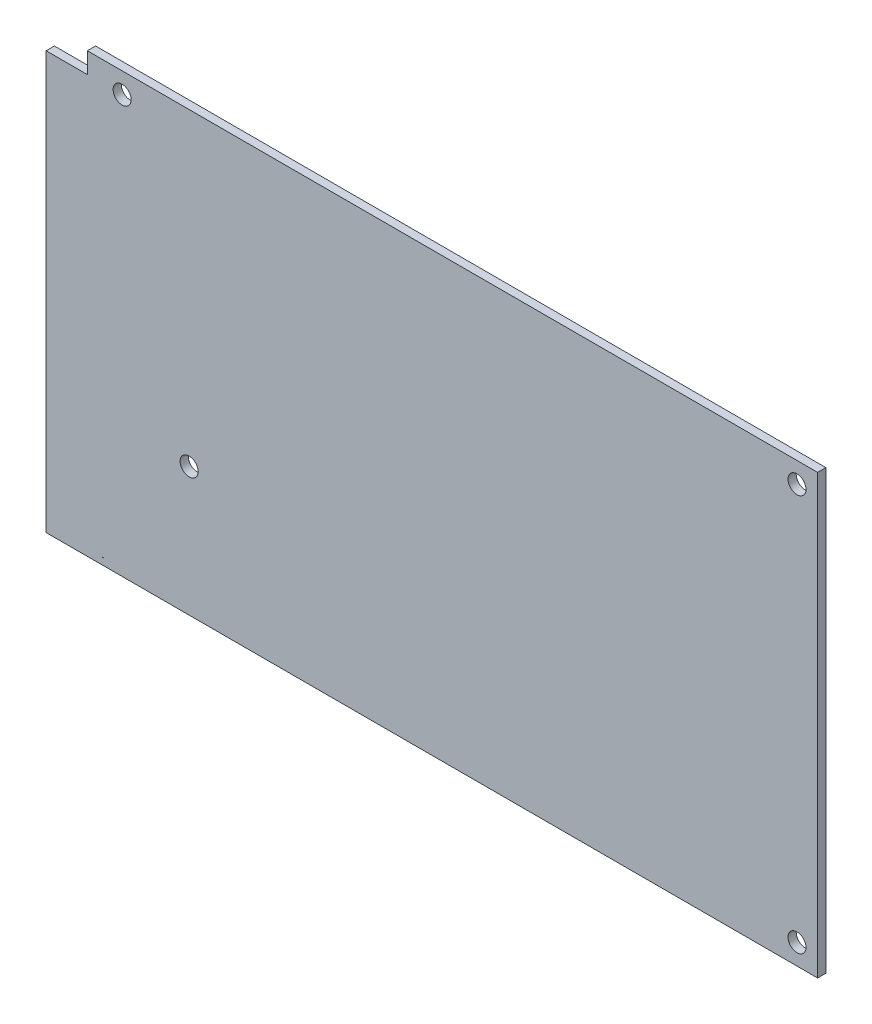
ISO-10303-21;
HEADER;
FILE_DESCRIPTION(('STEP AP214'),'2;1');
FILE_NAME('part.step','',(''),(''),'','','');
FILE_SCHEMA(('AUTOMOTIVE_DESIGN { 1 0 10303 214 1 1 1 1 }'));
ENDSEC;
DATA;
#1=APPLICATION_CONTEXT('core data for automotive mechanical design processes');
#2=APPLICATION_PROTOCOL_DEFINITION('international standard','automotive_design',2000,#1);
#3=PRODUCT_CONTEXT('',#1,'mechanical');
#4=PRODUCT('Part','Part','',(#3));
#5=PRODUCT_RELATED_PRODUCT_CATEGORY('part','',(#4));
#6=PRODUCT_DEFINITION_FORMATION('','',#4);
#7=PRODUCT_DEFINITION_CONTEXT('part definition',#1,'design');
#8=PRODUCT_DEFINITION('design','',#6,#7);
#9=PRODUCT_DEFINITION_SHAPE('','',#8);
#10=(LENGTH_UNIT() NAMED_UNIT(*) SI_UNIT(.MILLI.,.METRE.));
#11=(NAMED_UNIT(*) PLANE_ANGLE_UNIT() SI_UNIT($,.RADIAN.));
#12=(NAMED_UNIT(*) SI_UNIT($,.STERADIAN.) SOLID_ANGLE_UNIT());
#13=UNCERTAINTY_MEASURE_WITH_UNIT(LENGTH_MEASURE(1.E-05),#10,'distance_accuracy_value','');
#14=(GEOMETRIC_REPRESENTATION_CONTEXT(3) GLOBAL_UNCERTAINTY_ASSIGNED_CONTEXT((#13)) GLOBAL_UNIT_ASSIGNED_CONTEXT((#10,
#11,#12)) REPRESENTATION_CONTEXT('',''));
#15=CARTESIAN_POINT('',(0.,0.,0.));
#16=DIRECTION('',(0.,0.,1.));
#17=DIRECTION('',(1.,0.,0.));
#18=AXIS2_PLACEMENT_3D('',#15,#16,#17);
#19=CARTESIAN_POINT('',(-320.416526513662,209.024578512726,0.));
#20=DIRECTION('',(0.,-1.,0.));
#21=DIRECTION('',(0.,0.,-1.));
#22=AXIS2_PLACEMENT_3D('',#19,#20,#21);
#23=PLANE('',#22);
#24=DIRECTION('',(1.,0.,0.));
#25=VECTOR('',#24,1.);
#26=CARTESIAN_POINT('',(0.,209.024578512726,-1.6));
#27=LINE('',#26,#25);
#28=CARTESIAN_POINT('',(-329.416526513622,209.024578512726,-1.6));
#29=VERTEX_POINT('',#28);
#30=CARTESIAN_POINT('',(-179.666526514231,209.024578512726,-1.6));
#31=VERTEX_POINT('',#30);
#32=EDGE_CURVE('E11',#29,#31,#27,.T.);
#33=ORIENTED_EDGE('',*,*,#32,.T.);
#34=DIRECTION('',(0.,0.,1.));
#35=VECTOR('',#34,1.);
#36=CARTESIAN_POINT('',(-179.666526514231,209.024578512726,0.));
#37=LINE('',#36,#35);
#38=CARTESIAN_POINT('',(-179.666526514231,209.024578512726,0.));
#39=VERTEX_POINT('',#38);
#40=EDGE_CURVE('E27',#31,#39,#37,.T.);
#41=ORIENTED_EDGE('',*,*,#40,.T.);
#42=DIRECTION('',(1.,0.,0.));
#43=VECTOR('',#42,1.);
#44=CARTESIAN_POINT('',(0.,209.024578512726,0.));
#45=LINE('',#44,#43);
#46=CARTESIAN_POINT('',(-329.416526513622,209.024578512726,0.));
#47=VERTEX_POINT('',#46);
#48=EDGE_CURVE('E181',#47,#39,#45,.T.);
#49=ORIENTED_EDGE('',*,*,#48,.F.);
#50=DIRECTION('',(0.,0.,1.));
#51=VECTOR('',#50,1.);
#52=CARTESIAN_POINT('',(-329.416526513622,209.024578512726,0.));
#53=LINE('',#52,#51);
#54=EDGE_CURVE('E218',#29,#47,#53,.T.);
#55=ORIENTED_EDGE('',*,*,#54,.F.);
#56=EDGE_LOOP('',(#33,#41,#49,#55));
#57=FACE_BOUND('',#56,.T.);
#58=ADVANCED_FACE('F16',(#57),#23,.T.);
#59=CARTESIAN_POINT('',(-329.416526513622,299.374578512347,0.));
#60=DIRECTION('',(-1.,0.,0.));
#61=DIRECTION('',(0.,0.,1.));
#62=AXIS2_PLACEMENT_3D('',#59,#60,#61);
#63=PLANE('',#62);
#64=DIRECTION('',(0.,0.,1.));
#65=VECTOR('',#64,1.);
#66=CARTESIAN_POINT('',(-329.416526513622,290.024578512346,0.));
#67=LINE('',#66,#65);
#68=CARTESIAN_POINT('',(-329.416526513622,290.024578512346,-1.6));
#69=VERTEX_POINT('',#68);
#70=CARTESIAN_POINT('',(-329.416526513622,290.024578512346,0.));
#71=VERTEX_POINT('',#70);
#72=EDGE_CURVE('E169',#69,#71,#67,.T.);
#73=ORIENTED_EDGE('',*,*,#72,.F.);
#74=DIRECTION('',(0.,-1.,0.));
#75=VECTOR('',#74,1.);
#76=CARTESIAN_POINT('',(-329.416526513622,0.,-1.6));
#77=LINE('',#76,#75);
#78=EDGE_CURVE('E225',#69,#29,#77,.T.);
#79=ORIENTED_EDGE('',*,*,#78,.T.);
#80=ORIENTED_EDGE('',*,*,#54,.T.);
#81=DIRECTION('',(0.,-1.,0.));
#82=VECTOR('',#81,1.);
#83=CARTESIAN_POINT('',(-329.416526513622,0.,0.));
#84=LINE('',#83,#82);
#85=EDGE_CURVE('E183',#71,#47,#84,.T.);
#86=ORIENTED_EDGE('',*,*,#85,.F.);
#87=EDGE_LOOP('',(#73,#79,#80,#86));
#88=FACE_BOUND('',#87,.T.);
#89=ADVANCED_FACE('F252',(#88),#63,.T.);
#90=CARTESIAN_POINT('',(-177.166526514231,294.024578512346,0.));
#91=DIRECTION('',(0.,1.,0.));
#92=DIRECTION('',(1.,0.,0.));
#93=AXIS2_PLACEMENT_3D('',#90,#91,#92);
#94=PLANE('',#93);
#95=DIRECTION('',(0.,0.,1.));
#96=VECTOR('',#95,1.);
#97=CARTESIAN_POINT('',(-321.416526513622,294.024578512346,0.));
#98=LINE('',#97,#96);
#99=CARTESIAN_POINT('',(-321.416526513622,294.024578512346,-1.6));
#100=VERTEX_POINT('',#99);
#101=CARTESIAN_POINT('',(-321.416526513622,294.024578512346,0.));
#102=VERTEX_POINT('',#101);
#103=EDGE_CURVE('E214',#100,#102,#98,.T.);
#104=ORIENTED_EDGE('',*,*,#103,.T.);
#105=DIRECTION('',(-1.,0.,0.));
#106=VECTOR('',#105,1.);
#107=CARTESIAN_POINT('',(0.,294.024578512346,0.));
#108=LINE('',#107,#106);
#109=CARTESIAN_POINT('',(-179.666526514231,294.024578512346,0.));
#110=VERTEX_POINT('',#109);
#111=EDGE_CURVE('E126',#110,#102,#108,.T.);
#112=ORIENTED_EDGE('',*,*,#111,.F.);
#113=DIRECTION('',(0.,0.,-1.));
#114=VECTOR('',#113,1.);
#115=CARTESIAN_POINT('',(-179.666526514231,294.024578512346,0.));
#116=LINE('',#115,#114);
#117=CARTESIAN_POINT('',(-179.666526514231,294.024578512346,-1.6));
#118=VERTEX_POINT('',#117);
#119=EDGE_CURVE('E209',#110,#118,#116,.T.);
#120=ORIENTED_EDGE('',*,*,#119,.T.);
#121=DIRECTION('',(-1.,0.,0.));
#122=VECTOR('',#121,1.);
#123=CARTESIAN_POINT('',(0.,294.024578512346,-1.6));
#124=LINE('',#123,#122);
#125=EDGE_CURVE('E114',#118,#100,#124,.T.);
#126=ORIENTED_EDGE('',*,*,#125,.T.);
#127=EDGE_LOOP('',(#104,#112,#120,#126));
#128=FACE_BOUND('',#127,.T.);
#129=ADVANCED_FACE('F18',(#128),#94,.T.);
#130=CARTESIAN_POINT('',(-179.666526514231,204.624578512726,0.));
#131=DIRECTION('',(1.,0.,0.));
#132=DIRECTION('',(0.,1.,0.));
#133=AXIS2_PLACEMENT_3D('',#130,#131,#132);
#134=PLANE('',#133);
#135=DIRECTION('',(0.,1.,0.));
#136=VECTOR('',#135,1.);
#137=CARTESIAN_POINT('',(-179.666526514231,0.,0.));
#138=LINE('',#137,#136);
#139=EDGE_CURVE('E184',#39,#110,#138,.T.);
#140=ORIENTED_EDGE('',*,*,#139,.F.);
#141=ORIENTED_EDGE('',*,*,#40,.F.);
#142=DIRECTION('',(0.,1.,0.));
#143=VECTOR('',#142,1.);
#144=CARTESIAN_POINT('',(-179.666526514231,0.,-1.6));
#145=LINE('',#144,#143);
#146=EDGE_CURVE('E165',#31,#118,#145,.T.);
#147=ORIENTED_EDGE('',*,*,#146,.T.);
#148=ORIENTED_EDGE('',*,*,#119,.F.);
#149=EDGE_LOOP('',(#140,#141,#147,#148));
#150=FACE_BOUND('',#149,.T.);
#151=ADVANCED_FACE('F260',(#150),#134,.T.);
#152=CARTESIAN_POINT('',(-321.416526513622,305.277074673588,-1.7600024));
#153=DIRECTION('',(1.,0.,0.));
#154=DIRECTION('',(0.,1.,0.));
#155=AXIS2_PLACEMENT_3D('',#152,#153,#154);
#156=PLANE('',#155);
#157=DIRECTION('',(0.,1.,0.));
#158=VECTOR('',#157,1.);
#159=CARTESIAN_POINT('',(-321.416526513622,0.,-1.6));
#160=LINE('',#159,#158);
#161=CARTESIAN_POINT('',(-321.416526513622,290.024578512346,-1.6));
#162=VERTEX_POINT('',#161);
#163=EDGE_CURVE('E160',#162,#100,#160,.T.);
#164=ORIENTED_EDGE('',*,*,#163,.F.);
#165=DIRECTION('',(0.,0.,1.));
#166=VECTOR('',#165,1.);
#167=CARTESIAN_POINT('',(-321.416526513622,290.024578512346,-1.7600024));
#168=LINE('',#167,#166);
#169=CARTESIAN_POINT('',(-321.416526513622,290.024578512346,0.));
#170=VERTEX_POINT('',#169);
#171=EDGE_CURVE('E156',#162,#170,#168,.T.);
#172=ORIENTED_EDGE('',*,*,#171,.T.);
#173=DIRECTION('',(0.,1.,0.));
#174=VECTOR('',#173,1.);
#175=CARTESIAN_POINT('',(-321.416526513622,0.,0.));
#176=LINE('',#175,#174);
#177=EDGE_CURVE('E146',#170,#102,#176,.T.);
#178=ORIENTED_EDGE('',*,*,#177,.T.);
#179=ORIENTED_EDGE('',*,*,#103,.F.);
#180=EDGE_LOOP('',(#164,#172,#178,#179));
#181=FACE_BOUND('',#180,.T.);
#182=ADVANCED_FACE('F159',(#181),#156,.F.);
#183=CARTESIAN_POINT('',(0.,0.,-1.6));
#184=DIRECTION('',(0.,0.,1.));
#185=DIRECTION('',(1.,0.,0.));
#186=AXIS2_PLACEMENT_3D('',#183,#184,#185);
#187=PLANE('',#186);
#188=DIRECTION('',(1.,0.,0.));
#189=VECTOR('',#188,1.);
#190=CARTESIAN_POINT('',(0.,290.024578512346,-1.6));
#191=LINE('',#190,#189);
#192=EDGE_CURVE('E20',#69,#162,#191,.T.);
#193=ORIENTED_EDGE('',*,*,#192,.T.);
#194=ORIENTED_EDGE('',*,*,#163,.T.);
#195=ORIENTED_EDGE('',*,*,#125,.F.);
#196=ORIENTED_EDGE('',*,*,#146,.F.);
#197=ORIENTED_EDGE('',*,*,#32,.F.);
#198=ORIENTED_EDGE('',*,*,#78,.F.);
#199=EDGE_LOOP('',(#193,#194,#195,#196,#197,#198));
#200=FACE_BOUND('',#199,.T.);
#201=CARTESIAN_POINT('',(-314.666530833691,290.024582112403,-1.6));
#202=DIRECTION('',(0.,0.,1.));
#203=DIRECTION('',(1.,0.,0.));
#204=AXIS2_PLACEMENT_3D('',#201,#202,#203);
#205=CIRCLE('',#204,1.75);
#206=CARTESIAN_POINT('',(-312.916530833691,290.024582112403,-1.6));
#207=VERTEX_POINT('',#206);
#208=EDGE_CURVE('E190',#207,#207,#205,.T.);
#209=ORIENTED_EDGE('',*,*,#208,.T.);
#210=EDGE_LOOP('',(#209));
#211=FACE_BOUND('',#210,.T.);
#212=CARTESIAN_POINT('',(-301.666528893743,234.024579812627,-1.6));
#213=DIRECTION('',(0.,0.,1.));
#214=DIRECTION('',(1.,0.,0.));
#215=AXIS2_PLACEMENT_3D('',#212,#213,#214);
#216=CIRCLE('',#215,1.75);
#217=CARTESIAN_POINT('',(-299.916528893743,234.024579812627,-1.6));
#218=VERTEX_POINT('',#217);
#219=EDGE_CURVE('E186',#218,#218,#216,.T.);
#220=ORIENTED_EDGE('',*,*,#219,.T.);
#221=EDGE_LOOP('',(#220));
#222=FACE_BOUND('',#221,.T.);
#223=CARTESIAN_POINT('',(-183.666526134215,290.024584652403,-1.6));
#224=DIRECTION('',(0.,0.,1.));
#225=DIRECTION('',(1.,0.,0.));
#226=AXIS2_PLACEMENT_3D('',#223,#224,#225);
#227=CIRCLE('',#226,1.75);
#228=CARTESIAN_POINT('',(-181.916526134215,290.024584652403,-1.6));
#229=VERTEX_POINT('',#228);
#230=EDGE_CURVE('E191',#229,#229,#227,.T.);
#231=ORIENTED_EDGE('',*,*,#230,.T.);
#232=EDGE_LOOP('',(#231));
#233=FACE_BOUND('',#232,.T.);
#234=CARTESIAN_POINT('',(-318.370868385899,210.372358304528,-1.6));
#235=DIRECTION('',(0.,0.,1.));
#236=DIRECTION('',(1.,0.,0.));
#237=AXIS2_PLACEMENT_3D('',#234,#235,#236);
#238=CIRCLE('',#237,0.0624992399997881);
#239=CARTESIAN_POINT('',(-318.433367625898,210.372358304528,-1.6));
#240=VERTEX_POINT('',#239);
#241=EDGE_CURVE('E202',#240,#240,#238,.T.);
#242=ORIENTED_EDGE('',*,*,#241,.T.);
#243=EDGE_LOOP('',(#242));
#244=FACE_BOUND('',#243,.T.);
#245=CARTESIAN_POINT('',(-183.666523594215,213.024576092711,-1.6));
#246=DIRECTION('',(0.,0.,1.));
#247=DIRECTION('',(1.,0.,0.));
#248=AXIS2_PLACEMENT_3D('',#245,#246,#247);
#249=CIRCLE('',#248,1.75);
#250=CARTESIAN_POINT('',(-181.916523594215,213.024576092711,-1.6));
#251=VERTEX_POINT('',#250);
#252=EDGE_CURVE('E175',#251,#251,#249,.T.);
#253=ORIENTED_EDGE('',*,*,#252,.T.);
#254=EDGE_LOOP('',(#253));
#255=FACE_BOUND('',#254,.T.);
#256=ADVANCED_FACE('F269',(#200,#211,#222,#233,#244,#255),#187,.F.);
#257=CARTESIAN_POINT('',(-321.416526513622,290.024578512346,-1.7600024));
#258=DIRECTION('',(0.,-1.,0.));
#259=DIRECTION('',(0.,0.,-1.));
#260=AXIS2_PLACEMENT_3D('',#257,#258,#259);
#261=PLANE('',#260);
#262=ORIENTED_EDGE('',*,*,#72,.T.);
#263=DIRECTION('',(1.,0.,0.));
#264=VECTOR('',#263,1.);
#265=CARTESIAN_POINT('',(0.,290.024578512346,0.));
#266=LINE('',#265,#264);
#267=EDGE_CURVE('E151',#71,#170,#266,.T.);
#268=ORIENTED_EDGE('',*,*,#267,.T.);
#269=ORIENTED_EDGE('',*,*,#171,.F.);
#270=ORIENTED_EDGE('',*,*,#192,.F.);
#271=EDGE_LOOP('',(#262,#268,#269,#270));
#272=FACE_BOUND('',#271,.T.);
#273=ADVANCED_FACE('F168',(#272),#261,.F.);
#274=CARTESIAN_POINT('',(-183.666523594215,213.024576092711,-1.7600024));
#275=DIRECTION('',(0.,0.,1.));
#276=DIRECTION('',(1.,0.,0.));
#277=AXIS2_PLACEMENT_3D('',#274,#275,#276);
#278=CYLINDRICAL_SURFACE('',#277,1.75);
#279=ORIENTED_EDGE('',*,*,#252,.F.);
#280=EDGE_LOOP('',(#279));
#281=FACE_BOUND('',#280,.T.);
#282=CARTESIAN_POINT('',(-183.666523594215,213.024576092711,0.));
#283=DIRECTION('',(0.,0.,1.));
#284=DIRECTION('',(1.,0.,0.));
#285=AXIS2_PLACEMENT_3D('',#282,#283,#284);
#286=CIRCLE('',#285,1.75);
#287=CARTESIAN_POINT('',(-181.916523594215,213.024576092711,0.));
#288=VERTEX_POINT('',#287);
#289=EDGE_CURVE('E70',#288,#288,#286,.T.);
#290=ORIENTED_EDGE('',*,*,#289,.T.);
#291=EDGE_LOOP('',(#290));
#292=FACE_BOUND('',#291,.T.);
#293=ADVANCED_FACE('F265',(#281,#292),#278,.F.);
#294=CARTESIAN_POINT('',(-314.666530833691,290.024582112403,-1.7600024));
#295=DIRECTION('',(0.,0.,1.));
#296=DIRECTION('',(1.,0.,0.));
#297=AXIS2_PLACEMENT_3D('',#294,#295,#296);
#298=CYLINDRICAL_SURFACE('',#297,1.75);
#299=ORIENTED_EDGE('',*,*,#208,.F.);
#300=EDGE_LOOP('',(#299));
#301=FACE_BOUND('',#300,.T.);
#302=CARTESIAN_POINT('',(-314.666530833691,290.024582112403,0.));
#303=DIRECTION('',(0.,0.,1.));
#304=DIRECTION('',(1.,0.,0.));
#305=AXIS2_PLACEMENT_3D('',#302,#303,#304);
#306=CIRCLE('',#305,1.75);
#307=CARTESIAN_POINT('',(-312.916530833691,290.024582112403,0.));
#308=VERTEX_POINT('',#307);
#309=EDGE_CURVE('E79',#308,#308,#306,.T.);
#310=ORIENTED_EDGE('',*,*,#309,.T.);
#311=EDGE_LOOP('',(#310));
#312=FACE_BOUND('',#311,.T.);
#313=ADVANCED_FACE('F245',(#301,#312),#298,.F.);
#314=CARTESIAN_POINT('',(-301.666528893743,234.024579812627,-1.7600024));
#315=DIRECTION('',(0.,0.,1.));
#316=DIRECTION('',(1.,0.,0.));
#317=AXIS2_PLACEMENT_3D('',#314,#315,#316);
#318=CYLINDRICAL_SURFACE('',#317,1.75);
#319=ORIENTED_EDGE('',*,*,#219,.F.);
#320=EDGE_LOOP('',(#319));
#321=FACE_BOUND('',#320,.T.);
#322=CARTESIAN_POINT('',(-301.666528893743,234.024579812627,0.));
#323=DIRECTION('',(0.,0.,1.));
#324=DIRECTION('',(1.,0.,0.));
#325=AXIS2_PLACEMENT_3D('',#322,#323,#324);
#326=CIRCLE('',#325,1.75);
#327=CARTESIAN_POINT('',(-299.916528893743,234.024579812627,0.));
#328=VERTEX_POINT('',#327);
#329=EDGE_CURVE('E203',#328,#328,#326,.T.);
#330=ORIENTED_EDGE('',*,*,#329,.T.);
#331=EDGE_LOOP('',(#330));
#332=FACE_BOUND('',#331,.T.);
#333=ADVANCED_FACE('F235',(#321,#332),#318,.F.);
#334=CARTESIAN_POINT('',(-183.666526134215,290.024584652403,-1.7600024));
#335=DIRECTION('',(0.,0.,1.));
#336=DIRECTION('',(1.,0.,0.));
#337=AXIS2_PLACEMENT_3D('',#334,#335,#336);
#338=CYLINDRICAL_SURFACE('',#337,1.75);
#339=ORIENTED_EDGE('',*,*,#230,.F.);
#340=EDGE_LOOP('',(#339));
#341=FACE_BOUND('',#340,.T.);
#342=CARTESIAN_POINT('',(-183.666526134215,290.024584652403,0.));
#343=DIRECTION('',(0.,0.,1.));
#344=DIRECTION('',(1.,0.,0.));
#345=AXIS2_PLACEMENT_3D('',#342,#343,#344);
#346=CIRCLE('',#345,1.75);
#347=CARTESIAN_POINT('',(-181.916526134215,290.024584652403,0.));
#348=VERTEX_POINT('',#347);
#349=EDGE_CURVE('E100',#348,#348,#346,.T.);
#350=ORIENTED_EDGE('',*,*,#349,.T.);
#351=EDGE_LOOP('',(#350));
#352=FACE_BOUND('',#351,.T.);
#353=ADVANCED_FACE('F232',(#341,#352),#338,.F.);
#354=CARTESIAN_POINT('',(-318.370868385899,210.372358304528,-1.7600024));
#355=DIRECTION('',(0.,0.,1.));
#356=DIRECTION('',(1.,0.,0.));
#357=AXIS2_PLACEMENT_3D('',#354,#355,#356);
#358=CYLINDRICAL_SURFACE('',#357,0.0624992399997164);
#359=CARTESIAN_POINT('',(-318.370868385899,210.372358304528,0.));
#360=DIRECTION('',(0.,0.,1.));
#361=DIRECTION('',(1.,0.,0.));
#362=AXIS2_PLACEMENT_3D('',#359,#360,#361);
#363=CIRCLE('',#362,0.0624992399997881);
#364=CARTESIAN_POINT('',(-318.308369145899,210.372358304528,0.));
#365=VERTEX_POINT('',#364);
#366=EDGE_CURVE('E91',#365,#365,#363,.T.);
#367=ORIENTED_EDGE('',*,*,#366,.T.);
#368=EDGE_LOOP('',(#367));
#369=FACE_BOUND('',#368,.T.);
#370=ORIENTED_EDGE('',*,*,#241,.F.);
#371=EDGE_LOOP('',(#370));
#372=FACE_BOUND('',#371,.T.);
#373=ADVANCED_FACE('F234',(#369,#372),#358,.F.);
#374=CARTESIAN_POINT('',(0.,0.,0.));
#375=DIRECTION('',(0.,0.,1.));
#376=DIRECTION('',(1.,0.,0.));
#377=AXIS2_PLACEMENT_3D('',#374,#375,#376);
#378=PLANE('',#377);
#379=ORIENTED_EDGE('',*,*,#85,.T.);
#380=ORIENTED_EDGE('',*,*,#48,.T.);
#381=ORIENTED_EDGE('',*,*,#139,.T.);
#382=ORIENTED_EDGE('',*,*,#111,.T.);
#383=ORIENTED_EDGE('',*,*,#177,.F.);
#384=ORIENTED_EDGE('',*,*,#267,.F.);
#385=EDGE_LOOP('',(#379,#380,#381,#382,#383,#384));
#386=FACE_BOUND('',#385,.T.);
#387=ORIENTED_EDGE('',*,*,#366,.F.);
#388=EDGE_LOOP('',(#387));
#389=FACE_BOUND('',#388,.T.);
#390=ORIENTED_EDGE('',*,*,#309,.F.);
#391=EDGE_LOOP('',(#390));
#392=FACE_BOUND('',#391,.T.);
#393=ORIENTED_EDGE('',*,*,#329,.F.);
#394=EDGE_LOOP('',(#393));
#395=FACE_BOUND('',#394,.T.);
#396=ORIENTED_EDGE('',*,*,#349,.F.);
#397=EDGE_LOOP('',(#396));
#398=FACE_BOUND('',#397,.T.);
#399=ORIENTED_EDGE('',*,*,#289,.F.);
#400=EDGE_LOOP('',(#399));
#401=FACE_BOUND('',#400,.T.);
#402=ADVANCED_FACE('F149',(#386,#389,#392,#395,#398,#401),#378,.T.);
#403=CLOSED_SHELL('',(#58,#89,#129,#151,#182,#256,#273,#293,#313,#333,#353,#373,#402));
#404=MANIFOLD_SOLID_BREP('B1',#403);
#405=ADVANCED_BREP_SHAPE_REPRESENTATION('',(#18,#404),#14);
#406=SHAPE_DEFINITION_REPRESENTATION(#9,#405);
ENDSEC;
END-ISO-10303-21;
